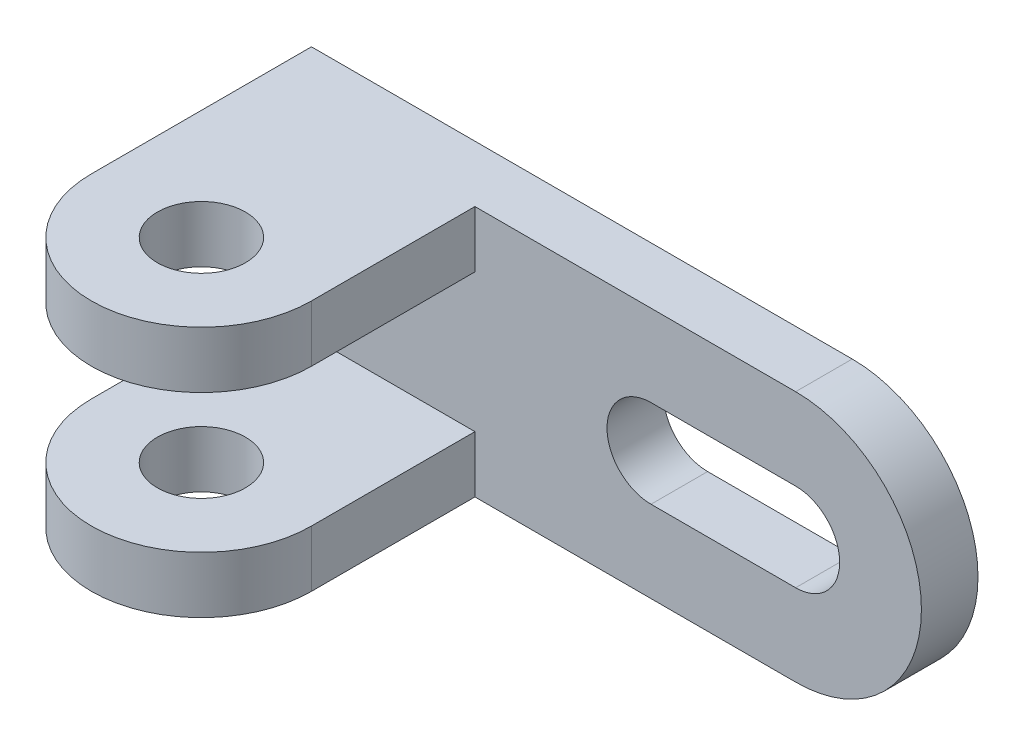
ISO-10303-21;
HEADER;
FILE_DESCRIPTION(('STEP AP214'),'2;1');
FILE_NAME('part.step','',(''),(''),'','','');
FILE_SCHEMA(('AUTOMOTIVE_DESIGN { 1 0 10303 214 1 1 1 1 }'));
ENDSEC;
DATA;
#1=APPLICATION_CONTEXT('core data for automotive mechanical design processes');
#2=APPLICATION_PROTOCOL_DEFINITION('international standard','automotive_design',2000,#1);
#3=PRODUCT_CONTEXT('',#1,'mechanical');
#4=PRODUCT('Part','Part','',(#3));
#5=PRODUCT_RELATED_PRODUCT_CATEGORY('part','',(#4));
#6=PRODUCT_DEFINITION_FORMATION('','',#4);
#7=PRODUCT_DEFINITION_CONTEXT('part definition',#1,'design');
#8=PRODUCT_DEFINITION('design','',#6,#7);
#9=PRODUCT_DEFINITION_SHAPE('','',#8);
#10=(LENGTH_UNIT() NAMED_UNIT(*) SI_UNIT(.MILLI.,.METRE.));
#11=(NAMED_UNIT(*) PLANE_ANGLE_UNIT() SI_UNIT($,.RADIAN.));
#12=(NAMED_UNIT(*) SI_UNIT($,.STERADIAN.) SOLID_ANGLE_UNIT());
#13=UNCERTAINTY_MEASURE_WITH_UNIT(LENGTH_MEASURE(1.E-05),#10,'distance_accuracy_value','');
#14=(GEOMETRIC_REPRESENTATION_CONTEXT(3) GLOBAL_UNCERTAINTY_ASSIGNED_CONTEXT((#13)) GLOBAL_UNIT_ASSIGNED_CONTEXT((#10,
#11,#12)) REPRESENTATION_CONTEXT('',''));
#15=CARTESIAN_POINT('',(0.,0.,0.));
#16=DIRECTION('',(0.,0.,1.));
#17=DIRECTION('',(1.,0.,0.));
#18=AXIS2_PLACEMENT_3D('',#15,#16,#17);
#19=CARTESIAN_POINT('',(0.,0.,9.));
#20=DIRECTION('',(0.,0.,1.));
#21=DIRECTION('',(1.,0.,0.));
#22=AXIS2_PLACEMENT_3D('',#19,#20,#21);
#23=PLANE('',#22);
#24=CARTESIAN_POINT('',(-23.,0.,9.));
#25=DIRECTION('',(0.,0.,1.));
#26=DIRECTION('',(1.,0.,0.));
#27=AXIS2_PLACEMENT_3D('',#24,#25,#26);
#28=CIRCLE('',#27,7.);
#29=CARTESIAN_POINT('',(-23.,7.,9.));
#30=VERTEX_POINT('',#29);
#31=CARTESIAN_POINT('',(-23.,-7.,9.));
#32=VERTEX_POINT('',#31);
#33=EDGE_CURVE('E241',#30,#32,#28,.T.);
#34=ORIENTED_EDGE('',*,*,#33,.F.);
#35=DIRECTION('',(1.,0.,0.));
#36=VECTOR('',#35,1.);
#37=CARTESIAN_POINT('',(0.,7.,9.));
#38=LINE('',#37,#36);
#39=CARTESIAN_POINT('',(0.,7.,9.));
#40=VERTEX_POINT('',#39);
#41=EDGE_CURVE('E245',#30,#40,#38,.T.);
#42=ORIENTED_EDGE('',*,*,#41,.T.);
#43=CARTESIAN_POINT('',(0.,0.,9.));
#44=DIRECTION('',(0.,0.,1.));
#45=DIRECTION('',(1.,0.,0.));
#46=AXIS2_PLACEMENT_3D('',#43,#44,#45);
#47=CIRCLE('',#46,7.);
#48=CARTESIAN_POINT('',(0.,-7.,9.));
#49=VERTEX_POINT('',#48);
#50=EDGE_CURVE('E249',#49,#40,#47,.T.);
#51=ORIENTED_EDGE('',*,*,#50,.F.);
#52=DIRECTION('',(1.,0.,0.));
#53=VECTOR('',#52,1.);
#54=CARTESIAN_POINT('',(0.,-7.,9.));
#55=LINE('',#54,#53);
#56=EDGE_CURVE('E253',#32,#49,#55,.T.);
#57=ORIENTED_EDGE('',*,*,#56,.F.);
#58=EDGE_LOOP('',(#34,#42,#51,#57));
#59=FACE_BOUND('',#58,.T.);
#60=DIRECTION('',(-1.,0.,0.));
#61=VECTOR('',#60,1.);
#62=CARTESIAN_POINT('',(0.,20.,9.));
#63=LINE('',#62,#61);
#64=CARTESIAN_POINT('',(0.,20.,9.));
#65=VERTEX_POINT('',#64);
#66=CARTESIAN_POINT('',(-51.,20.,9.));
#67=VERTEX_POINT('',#66);
#68=EDGE_CURVE('E263',#65,#67,#63,.T.);
#69=ORIENTED_EDGE('',*,*,#68,.T.);
#70=DIRECTION('',(0.,1.,0.));
#71=VECTOR('',#70,1.);
#72=CARTESIAN_POINT('',(-51.,11.,9.));
#73=LINE('',#72,#71);
#74=CARTESIAN_POINT('',(-51.,11.,9.));
#75=VERTEX_POINT('',#74);
#76=EDGE_CURVE('E63',#75,#67,#73,.T.);
#77=ORIENTED_EDGE('',*,*,#76,.F.);
#78=DIRECTION('',(1.,0.,0.));
#79=VECTOR('',#78,1.);
#80=CARTESIAN_POINT('',(0.,11.,9.));
#81=LINE('',#80,#79);
#82=CARTESIAN_POINT('',(-86.,11.,9.));
#83=VERTEX_POINT('',#82);
#84=EDGE_CURVE('E67',#83,#75,#81,.T.);
#85=ORIENTED_EDGE('',*,*,#84,.F.);
#86=DIRECTION('',(0.,-1.,0.));
#87=VECTOR('',#86,1.);
#88=CARTESIAN_POINT('',(-86.,0.,9.));
#89=LINE('',#88,#87);
#90=CARTESIAN_POINT('',(-86.,-11.,9.));
#91=VERTEX_POINT('',#90);
#92=EDGE_CURVE('E173',#83,#91,#89,.T.);
#93=ORIENTED_EDGE('',*,*,#92,.T.);
#94=DIRECTION('',(-1.,0.,0.));
#95=VECTOR('',#94,1.);
#96=CARTESIAN_POINT('',(0.,-11.,9.));
#97=LINE('',#96,#95);
#98=CARTESIAN_POINT('',(-51.,-11.,9.));
#99=VERTEX_POINT('',#98);
#100=EDGE_CURVE('E211',#99,#91,#97,.T.);
#101=ORIENTED_EDGE('',*,*,#100,.F.);
#102=DIRECTION('',(0.,-1.,0.));
#103=VECTOR('',#102,1.);
#104=CARTESIAN_POINT('',(-51.,-11.,9.));
#105=LINE('',#104,#103);
#106=CARTESIAN_POINT('',(-51.,-20.,9.));
#107=VERTEX_POINT('',#106);
#108=EDGE_CURVE('E234',#99,#107,#105,.T.);
#109=ORIENTED_EDGE('',*,*,#108,.T.);
#110=DIRECTION('',(1.,0.,0.));
#111=VECTOR('',#110,1.);
#112=CARTESIAN_POINT('',(0.,-20.,9.));
#113=LINE('',#112,#111);
#114=CARTESIAN_POINT('',(0.,-20.,9.));
#115=VERTEX_POINT('',#114);
#116=EDGE_CURVE('E257',#107,#115,#113,.T.);
#117=ORIENTED_EDGE('',*,*,#116,.T.);
#118=CARTESIAN_POINT('',(0.,0.,9.));
#119=DIRECTION('',(0.,0.,1.));
#120=DIRECTION('',(1.,0.,0.));
#121=AXIS2_PLACEMENT_3D('',#118,#119,#120);
#122=CIRCLE('',#121,20.);
#123=EDGE_CURVE('E260',#115,#65,#122,.T.);
#124=ORIENTED_EDGE('',*,*,#123,.T.);
#125=EDGE_LOOP('',(#69,#77,#85,#93,#101,#109,#117,#124));
#126=FACE_BOUND('',#125,.T.);
#127=ADVANCED_FACE('F45',(#59,#126),#23,.T.);
#128=CARTESIAN_POINT('',(0.,-20.,9.));
#129=DIRECTION('',(0.,1.,0.));
#130=DIRECTION('',(-1.,0.,0.));
#131=AXIS2_PLACEMENT_3D('',#128,#129,#130);
#132=PLANE('',#131);
#133=DIRECTION('',(1.,0.,0.));
#134=VECTOR('',#133,1.);
#135=CARTESIAN_POINT('',(0.,-20.,0.));
#136=LINE('',#135,#134);
#137=CARTESIAN_POINT('',(-86.,-20.,0.));
#138=VERTEX_POINT('',#137);
#139=CARTESIAN_POINT('',(0.,-20.,0.));
#140=VERTEX_POINT('',#139);
#141=EDGE_CURVE('E284',#138,#140,#136,.T.);
#142=ORIENTED_EDGE('',*,*,#141,.T.);
#143=DIRECTION('',(0.,0.,-1.));
#144=VECTOR('',#143,1.);
#145=CARTESIAN_POINT('',(0.,-20.,9.));
#146=LINE('',#145,#144);
#147=EDGE_CURVE('E11',#115,#140,#146,.T.);
#148=ORIENTED_EDGE('',*,*,#147,.F.);
#149=ORIENTED_EDGE('',*,*,#116,.F.);
#150=DIRECTION('',(0.,0.,1.));
#151=VECTOR('',#150,1.);
#152=CARTESIAN_POINT('',(-51.,-20.,0.));
#153=LINE('',#152,#151);
#154=CARTESIAN_POINT('',(-51.,-20.,35.));
#155=VERTEX_POINT('',#154);
#156=EDGE_CURVE('E204',#107,#155,#153,.T.);
#157=ORIENTED_EDGE('',*,*,#156,.T.);
#158=CARTESIAN_POINT('',(-68.5,-20.,35.));
#159=DIRECTION('',(0.,-1.,0.));
#160=DIRECTION('',(1.,0.,0.));
#161=AXIS2_PLACEMENT_3D('',#158,#159,#160);
#162=CIRCLE('',#161,17.5);
#163=CARTESIAN_POINT('',(-86.,-20.,35.));
#164=VERTEX_POINT('',#163);
#165=EDGE_CURVE('E223',#155,#164,#162,.T.);
#166=ORIENTED_EDGE('',*,*,#165,.T.);
#167=DIRECTION('',(0.,0.,-1.));
#168=VECTOR('',#167,1.);
#169=CARTESIAN_POINT('',(-86.,-20.,9.));
#170=LINE('',#169,#168);
#171=EDGE_CURVE('E296',#164,#138,#170,.T.);
#172=ORIENTED_EDGE('',*,*,#171,.T.);
#173=EDGE_LOOP('',(#142,#148,#149,#157,#166,#172));
#174=FACE_BOUND('',#173,.T.);
#175=CARTESIAN_POINT('',(-68.5,-20.,35.));
#176=DIRECTION('',(0.,-1.,0.));
#177=DIRECTION('',(1.,0.,0.));
#178=AXIS2_PLACEMENT_3D('',#175,#176,#177);
#179=CIRCLE('',#178,7.00000000000001);
#180=CARTESIAN_POINT('',(-61.5,-20.,35.));
#181=VERTEX_POINT('',#180);
#182=EDGE_CURVE('E196',#181,#181,#179,.T.);
#183=ORIENTED_EDGE('',*,*,#182,.F.);
#184=EDGE_LOOP('',(#183));
#185=FACE_BOUND('',#184,.T.);
#186=ADVANCED_FACE('F340',(#174,#185),#132,.F.);
#187=CARTESIAN_POINT('',(0.,0.,9.));
#188=DIRECTION('',(0.,0.,-1.));
#189=DIRECTION('',(-1.,0.,0.));
#190=AXIS2_PLACEMENT_3D('',#187,#188,#189);
#191=CYLINDRICAL_SURFACE('',#190,20.);
#192=CARTESIAN_POINT('',(0.,0.,0.));
#193=DIRECTION('',(0.,0.,1.));
#194=DIRECTION('',(1.,0.,0.));
#195=AXIS2_PLACEMENT_3D('',#192,#193,#194);
#196=CIRCLE('',#195,20.);
#197=CARTESIAN_POINT('',(0.,20.,0.));
#198=VERTEX_POINT('',#197);
#199=EDGE_CURVE('E288',#140,#198,#196,.T.);
#200=ORIENTED_EDGE('',*,*,#199,.T.);
#201=DIRECTION('',(0.,0.,-1.));
#202=VECTOR('',#201,1.);
#203=CARTESIAN_POINT('',(0.,20.,9.));
#204=LINE('',#203,#202);
#205=EDGE_CURVE('E55',#65,#198,#204,.T.);
#206=ORIENTED_EDGE('',*,*,#205,.F.);
#207=ORIENTED_EDGE('',*,*,#123,.F.);
#208=ORIENTED_EDGE('',*,*,#147,.T.);
#209=EDGE_LOOP('',(#200,#206,#207,#208));
#210=FACE_BOUND('',#209,.T.);
#211=ADVANCED_FACE('F346',(#210),#191,.T.);
#212=CARTESIAN_POINT('',(0.,20.,9.));
#213=DIRECTION('',(0.,-1.,0.));
#214=DIRECTION('',(1.,0.,0.));
#215=AXIS2_PLACEMENT_3D('',#212,#213,#214);
#216=PLANE('',#215);
#217=DIRECTION('',(-1.,0.,0.));
#218=VECTOR('',#217,1.);
#219=CARTESIAN_POINT('',(0.,20.,0.));
#220=LINE('',#219,#218);
#221=CARTESIAN_POINT('',(-86.,20.,0.));
#222=VERTEX_POINT('',#221);
#223=EDGE_CURVE('E291',#198,#222,#220,.T.);
#224=ORIENTED_EDGE('',*,*,#223,.T.);
#225=DIRECTION('',(0.,0.,-1.));
#226=VECTOR('',#225,1.);
#227=CARTESIAN_POINT('',(-86.,20.,9.));
#228=LINE('',#227,#226);
#229=CARTESIAN_POINT('',(-86.,20.,35.));
#230=VERTEX_POINT('',#229);
#231=EDGE_CURVE('E300',#230,#222,#228,.T.);
#232=ORIENTED_EDGE('',*,*,#231,.F.);
#233=CARTESIAN_POINT('',(-68.5,20.,35.));
#234=DIRECTION('',(0.,1.,0.));
#235=DIRECTION('',(-1.,0.,0.));
#236=AXIS2_PLACEMENT_3D('',#233,#234,#235);
#237=CIRCLE('',#236,17.5);
#238=CARTESIAN_POINT('',(-51.,20.,35.));
#239=VERTEX_POINT('',#238);
#240=EDGE_CURVE('E153',#230,#239,#237,.T.);
#241=ORIENTED_EDGE('',*,*,#240,.T.);
#242=DIRECTION('',(0.,0.,1.));
#243=VECTOR('',#242,1.);
#244=CARTESIAN_POINT('',(-51.,20.,0.));
#245=LINE('',#244,#243);
#246=EDGE_CURVE('E179',#67,#239,#245,.T.);
#247=ORIENTED_EDGE('',*,*,#246,.F.);
#248=ORIENTED_EDGE('',*,*,#68,.F.);
#249=ORIENTED_EDGE('',*,*,#205,.T.);
#250=EDGE_LOOP('',(#224,#232,#241,#247,#248,#249));
#251=FACE_BOUND('',#250,.T.);
#252=CARTESIAN_POINT('',(-68.5,20.,35.));
#253=DIRECTION('',(0.,1.,0.));
#254=DIRECTION('',(-1.,0.,0.));
#255=AXIS2_PLACEMENT_3D('',#252,#253,#254);
#256=CIRCLE('',#255,7.00000000000001);
#257=CARTESIAN_POINT('',(-75.5,20.,35.));
#258=VERTEX_POINT('',#257);
#259=EDGE_CURVE('E175',#258,#258,#256,.T.);
#260=ORIENTED_EDGE('',*,*,#259,.F.);
#261=EDGE_LOOP('',(#260));
#262=FACE_BOUND('',#261,.T.);
#263=ADVANCED_FACE('F358',(#251,#262),#216,.F.);
#264=CARTESIAN_POINT('',(-23.,0.,9.));
#265=DIRECTION('',(0.,0.,-1.));
#266=DIRECTION('',(-1.,0.,0.));
#267=AXIS2_PLACEMENT_3D('',#264,#265,#266);
#268=CYLINDRICAL_SURFACE('',#267,7.);
#269=CARTESIAN_POINT('',(-23.,0.,0.));
#270=DIRECTION('',(0.,0.,1.));
#271=DIRECTION('',(1.,0.,0.));
#272=AXIS2_PLACEMENT_3D('',#269,#270,#271);
#273=CIRCLE('',#272,7.);
#274=CARTESIAN_POINT('',(-23.,7.,0.));
#275=VERTEX_POINT('',#274);
#276=CARTESIAN_POINT('',(-23.,-7.,0.));
#277=VERTEX_POINT('',#276);
#278=EDGE_CURVE('E233',#275,#277,#273,.T.);
#279=ORIENTED_EDGE('',*,*,#278,.F.);
#280=DIRECTION('',(0.,0.,-1.));
#281=VECTOR('',#280,1.);
#282=CARTESIAN_POINT('',(-23.,7.,9.));
#283=LINE('',#282,#281);
#284=EDGE_CURVE('E49',#30,#275,#283,.T.);
#285=ORIENTED_EDGE('',*,*,#284,.F.);
#286=ORIENTED_EDGE('',*,*,#33,.T.);
#287=DIRECTION('',(0.,0.,-1.));
#288=VECTOR('',#287,1.);
#289=CARTESIAN_POINT('',(-23.,-7.,9.));
#290=LINE('',#289,#288);
#291=EDGE_CURVE('E268',#32,#277,#290,.T.);
#292=ORIENTED_EDGE('',*,*,#291,.T.);
#293=EDGE_LOOP('',(#279,#285,#286,#292));
#294=FACE_BOUND('',#293,.T.);
#295=ADVANCED_FACE('F47',(#294),#268,.F.);
#296=CARTESIAN_POINT('',(0.,7.,9.));
#297=DIRECTION('',(0.,1.,0.));
#298=DIRECTION('',(0.,0.,1.));
#299=AXIS2_PLACEMENT_3D('',#296,#297,#298);
#300=PLANE('',#299);
#301=DIRECTION('',(1.,0.,0.));
#302=VECTOR('',#301,1.);
#303=CARTESIAN_POINT('',(0.,7.,0.));
#304=LINE('',#303,#302);
#305=CARTESIAN_POINT('',(0.,7.,0.));
#306=VERTEX_POINT('',#305);
#307=EDGE_CURVE('E272',#275,#306,#304,.T.);
#308=ORIENTED_EDGE('',*,*,#307,.T.);
#309=DIRECTION('',(0.,0.,-1.));
#310=VECTOR('',#309,1.);
#311=CARTESIAN_POINT('',(0.,7.,9.));
#312=LINE('',#311,#310);
#313=EDGE_CURVE('E310',#40,#306,#312,.T.);
#314=ORIENTED_EDGE('',*,*,#313,.F.);
#315=ORIENTED_EDGE('',*,*,#41,.F.);
#316=ORIENTED_EDGE('',*,*,#284,.T.);
#317=EDGE_LOOP('',(#308,#314,#315,#316));
#318=FACE_BOUND('',#317,.T.);
#319=ADVANCED_FACE('F319',(#318),#300,.F.);
#320=CARTESIAN_POINT('',(0.,0.,9.));
#321=DIRECTION('',(0.,0.,-1.));
#322=DIRECTION('',(-1.,0.,0.));
#323=AXIS2_PLACEMENT_3D('',#320,#321,#322);
#324=CYLINDRICAL_SURFACE('',#323,7.);
#325=CARTESIAN_POINT('',(0.,0.,0.));
#326=DIRECTION('',(0.,0.,1.));
#327=DIRECTION('',(1.,0.,0.));
#328=AXIS2_PLACEMENT_3D('',#325,#326,#327);
#329=CIRCLE('',#328,7.);
#330=CARTESIAN_POINT('',(0.,-7.,0.));
#331=VERTEX_POINT('',#330);
#332=EDGE_CURVE('E276',#331,#306,#329,.T.);
#333=ORIENTED_EDGE('',*,*,#332,.F.);
#334=DIRECTION('',(0.,0.,-1.));
#335=VECTOR('',#334,1.);
#336=CARTESIAN_POINT('',(0.,-7.,9.));
#337=LINE('',#336,#335);
#338=EDGE_CURVE('E308',#49,#331,#337,.T.);
#339=ORIENTED_EDGE('',*,*,#338,.F.);
#340=ORIENTED_EDGE('',*,*,#50,.T.);
#341=ORIENTED_EDGE('',*,*,#313,.T.);
#342=EDGE_LOOP('',(#333,#339,#340,#341));
#343=FACE_BOUND('',#342,.T.);
#344=ADVANCED_FACE('F331',(#343),#324,.F.);
#345=CARTESIAN_POINT('',(0.,-7.,9.));
#346=DIRECTION('',(0.,1.,0.));
#347=DIRECTION('',(0.,0.,1.));
#348=AXIS2_PLACEMENT_3D('',#345,#346,#347);
#349=PLANE('',#348);
#350=DIRECTION('',(1.,0.,0.));
#351=VECTOR('',#350,1.);
#352=CARTESIAN_POINT('',(0.,-7.,0.));
#353=LINE('',#352,#351);
#354=EDGE_CURVE('E280',#277,#331,#353,.T.);
#355=ORIENTED_EDGE('',*,*,#354,.F.);
#356=ORIENTED_EDGE('',*,*,#291,.F.);
#357=ORIENTED_EDGE('',*,*,#56,.T.);
#358=ORIENTED_EDGE('',*,*,#338,.T.);
#359=EDGE_LOOP('',(#355,#356,#357,#358));
#360=FACE_BOUND('',#359,.T.);
#361=ADVANCED_FACE('F329',(#360),#349,.T.);
#362=CARTESIAN_POINT('',(-86.,0.,9.));
#363=DIRECTION('',(1.,0.,0.));
#364=DIRECTION('',(0.,0.,-1.));
#365=AXIS2_PLACEMENT_3D('',#362,#363,#364);
#366=PLANE('',#365);
#367=DIRECTION('',(0.,-1.,0.));
#368=VECTOR('',#367,1.);
#369=CARTESIAN_POINT('',(-86.,0.,0.));
#370=LINE('',#369,#368);
#371=EDGE_CURVE('E246',#222,#138,#370,.T.);
#372=ORIENTED_EDGE('',*,*,#371,.T.);
#373=ORIENTED_EDGE('',*,*,#171,.F.);
#374=DIRECTION('',(0.,-1.,0.));
#375=VECTOR('',#374,1.);
#376=CARTESIAN_POINT('',(-86.,-11.,35.));
#377=LINE('',#376,#375);
#378=CARTESIAN_POINT('',(-86.,-11.,35.));
#379=VERTEX_POINT('',#378);
#380=EDGE_CURVE('E219',#379,#164,#377,.T.);
#381=ORIENTED_EDGE('',*,*,#380,.F.);
#382=DIRECTION('',(0.,0.,1.));
#383=VECTOR('',#382,1.);
#384=CARTESIAN_POINT('',(-86.,-11.,0.));
#385=LINE('',#384,#383);
#386=EDGE_CURVE('E208',#91,#379,#385,.T.);
#387=ORIENTED_EDGE('',*,*,#386,.F.);
#388=ORIENTED_EDGE('',*,*,#92,.F.);
#389=DIRECTION('',(0.,0.,1.));
#390=VECTOR('',#389,1.);
#391=CARTESIAN_POINT('',(-86.,11.,0.));
#392=LINE('',#391,#390);
#393=CARTESIAN_POINT('',(-86.,11.,35.));
#394=VERTEX_POINT('',#393);
#395=EDGE_CURVE('E165',#83,#394,#392,.T.);
#396=ORIENTED_EDGE('',*,*,#395,.T.);
#397=DIRECTION('',(0.,1.,0.));
#398=VECTOR('',#397,1.);
#399=CARTESIAN_POINT('',(-86.,11.,35.));
#400=LINE('',#399,#398);
#401=EDGE_CURVE('E148',#394,#230,#400,.T.);
#402=ORIENTED_EDGE('',*,*,#401,.T.);
#403=ORIENTED_EDGE('',*,*,#231,.T.);
#404=EDGE_LOOP('',(#372,#373,#381,#387,#388,#396,#402,#403));
#405=FACE_BOUND('',#404,.T.);
#406=ADVANCED_FACE('F171',(#405),#366,.F.);
#407=CARTESIAN_POINT('',(0.,0.,0.));
#408=DIRECTION('',(0.,0.,1.));
#409=DIRECTION('',(1.,0.,0.));
#410=AXIS2_PLACEMENT_3D('',#407,#408,#409);
#411=PLANE('',#410);
#412=ORIENTED_EDGE('',*,*,#278,.T.);
#413=ORIENTED_EDGE('',*,*,#354,.T.);
#414=ORIENTED_EDGE('',*,*,#332,.T.);
#415=ORIENTED_EDGE('',*,*,#307,.F.);
#416=EDGE_LOOP('',(#412,#413,#414,#415));
#417=FACE_BOUND('',#416,.T.);
#418=ORIENTED_EDGE('',*,*,#141,.F.);
#419=ORIENTED_EDGE('',*,*,#371,.F.);
#420=ORIENTED_EDGE('',*,*,#223,.F.);
#421=ORIENTED_EDGE('',*,*,#199,.F.);
#422=EDGE_LOOP('',(#418,#419,#420,#421));
#423=FACE_BOUND('',#422,.T.);
#424=ADVANCED_FACE('F324',(#417,#423),#411,.F.);
#425=CARTESIAN_POINT('',(-68.5,-11.,35.));
#426=DIRECTION('',(0.,-1.,0.));
#427=DIRECTION('',(1.,0.,0.));
#428=AXIS2_PLACEMENT_3D('',#425,#426,#427);
#429=CYLINDRICAL_SURFACE('',#428,17.5);
#430=ORIENTED_EDGE('',*,*,#165,.F.);
#431=DIRECTION('',(0.,-1.,0.));
#432=VECTOR('',#431,1.);
#433=CARTESIAN_POINT('',(-51.,-11.,35.));
#434=LINE('',#433,#432);
#435=CARTESIAN_POINT('',(-51.,-11.,35.));
#436=VERTEX_POINT('',#435);
#437=EDGE_CURVE('E230',#436,#155,#434,.T.);
#438=ORIENTED_EDGE('',*,*,#437,.F.);
#439=CARTESIAN_POINT('',(-68.5,-11.,35.));
#440=DIRECTION('',(0.,-1.,0.));
#441=DIRECTION('',(1.,0.,0.));
#442=AXIS2_PLACEMENT_3D('',#439,#440,#441);
#443=CIRCLE('',#442,17.5);
#444=EDGE_CURVE('E203',#436,#379,#443,.T.);
#445=ORIENTED_EDGE('',*,*,#444,.T.);
#446=ORIENTED_EDGE('',*,*,#380,.T.);
#447=EDGE_LOOP('',(#430,#438,#445,#446));
#448=FACE_BOUND('',#447,.T.);
#449=ADVANCED_FACE('F355',(#448),#429,.T.);
#450=CARTESIAN_POINT('',(-51.,-11.,0.));
#451=DIRECTION('',(1.,0.,0.));
#452=DIRECTION('',(0.,1.,0.));
#453=AXIS2_PLACEMENT_3D('',#450,#451,#452);
#454=PLANE('',#453);
#455=ORIENTED_EDGE('',*,*,#156,.F.);
#456=ORIENTED_EDGE('',*,*,#108,.F.);
#457=DIRECTION('',(0.,0.,1.));
#458=VECTOR('',#457,1.);
#459=CARTESIAN_POINT('',(-51.,-11.,0.));
#460=LINE('',#459,#458);
#461=EDGE_CURVE('E215',#99,#436,#460,.T.);
#462=ORIENTED_EDGE('',*,*,#461,.T.);
#463=ORIENTED_EDGE('',*,*,#437,.T.);
#464=EDGE_LOOP('',(#455,#456,#462,#463));
#465=FACE_BOUND('',#464,.T.);
#466=ADVANCED_FACE('F386',(#465),#454,.T.);
#467=CARTESIAN_POINT('',(-68.5,-11.,35.));
#468=DIRECTION('',(0.,-1.,0.));
#469=DIRECTION('',(1.,0.,0.));
#470=AXIS2_PLACEMENT_3D('',#467,#468,#469);
#471=CYLINDRICAL_SURFACE('',#470,7.00000000000001);
#472=CARTESIAN_POINT('',(-68.5,-11.,35.));
#473=DIRECTION('',(0.,-1.,0.));
#474=DIRECTION('',(1.,0.,0.));
#475=AXIS2_PLACEMENT_3D('',#472,#473,#474);
#476=CIRCLE('',#475,7.00000000000001);
#477=CARTESIAN_POINT('',(-61.5,-11.,35.));
#478=VERTEX_POINT('',#477);
#479=EDGE_CURVE('E199',#478,#478,#476,.T.);
#480=ORIENTED_EDGE('',*,*,#479,.F.);
#481=EDGE_LOOP('',(#480));
#482=FACE_BOUND('',#481,.T.);
#483=ORIENTED_EDGE('',*,*,#182,.T.);
#484=EDGE_LOOP('',(#483));
#485=FACE_BOUND('',#484,.T.);
#486=ADVANCED_FACE('F351',(#482,#485),#471,.F.);
#487=CARTESIAN_POINT('',(0.,-11.,0.));
#488=DIRECTION('',(0.,-1.,0.));
#489=DIRECTION('',(1.,0.,0.));
#490=AXIS2_PLACEMENT_3D('',#487,#488,#489);
#491=PLANE('',#490);
#492=ORIENTED_EDGE('',*,*,#479,.T.);
#493=EDGE_LOOP('',(#492));
#494=FACE_BOUND('',#493,.T.);
#495=ORIENTED_EDGE('',*,*,#444,.F.);
#496=ORIENTED_EDGE('',*,*,#461,.F.);
#497=ORIENTED_EDGE('',*,*,#100,.T.);
#498=ORIENTED_EDGE('',*,*,#386,.T.);
#499=EDGE_LOOP('',(#495,#496,#497,#498));
#500=FACE_BOUND('',#499,.T.);
#501=ADVANCED_FACE('F384',(#494,#500),#491,.F.);
#502=CARTESIAN_POINT('',(-51.,11.,0.));
#503=DIRECTION('',(-1.,0.,0.));
#504=DIRECTION('',(0.,0.,1.));
#505=AXIS2_PLACEMENT_3D('',#502,#503,#504);
#506=PLANE('',#505);
#507=ORIENTED_EDGE('',*,*,#246,.T.);
#508=DIRECTION('',(0.,1.,0.));
#509=VECTOR('',#508,1.);
#510=CARTESIAN_POINT('',(-51.,11.,35.));
#511=LINE('',#510,#509);
#512=CARTESIAN_POINT('',(-51.,11.,35.));
#513=VERTEX_POINT('',#512);
#514=EDGE_CURVE('E158',#513,#239,#511,.T.);
#515=ORIENTED_EDGE('',*,*,#514,.F.);
#516=DIRECTION('',(0.,0.,1.));
#517=VECTOR('',#516,1.);
#518=CARTESIAN_POINT('',(-51.,11.,0.));
#519=LINE('',#518,#517);
#520=EDGE_CURVE('E167',#75,#513,#519,.T.);
#521=ORIENTED_EDGE('',*,*,#520,.F.);
#522=ORIENTED_EDGE('',*,*,#76,.T.);
#523=EDGE_LOOP('',(#507,#515,#521,#522));
#524=FACE_BOUND('',#523,.T.);
#525=ADVANCED_FACE('F397',(#524),#506,.F.);
#526=CARTESIAN_POINT('',(-68.5,11.,35.));
#527=DIRECTION('',(0.,1.,0.));
#528=DIRECTION('',(-1.,0.,0.));
#529=AXIS2_PLACEMENT_3D('',#526,#527,#528);
#530=CYLINDRICAL_SURFACE('',#529,17.5);
#531=ORIENTED_EDGE('',*,*,#240,.F.);
#532=ORIENTED_EDGE('',*,*,#401,.F.);
#533=CARTESIAN_POINT('',(-68.5,11.,35.));
#534=DIRECTION('',(0.,1.,0.));
#535=DIRECTION('',(-1.,0.,0.));
#536=AXIS2_PLACEMENT_3D('',#533,#534,#535);
#537=CIRCLE('',#536,17.5);
#538=EDGE_CURVE('E151',#394,#513,#537,.T.);
#539=ORIENTED_EDGE('',*,*,#538,.T.);
#540=ORIENTED_EDGE('',*,*,#514,.T.);
#541=EDGE_LOOP('',(#531,#532,#539,#540));
#542=FACE_BOUND('',#541,.T.);
#543=ADVANCED_FACE('F150',(#542),#530,.T.);
#544=CARTESIAN_POINT('',(-68.5,11.,35.));
#545=DIRECTION('',(0.,1.,0.));
#546=DIRECTION('',(-1.,0.,0.));
#547=AXIS2_PLACEMENT_3D('',#544,#545,#546);
#548=CYLINDRICAL_SURFACE('',#547,7.00000000000001);
#549=CARTESIAN_POINT('',(-68.5,11.,35.));
#550=DIRECTION('',(0.,1.,0.));
#551=DIRECTION('',(-1.,0.,0.));
#552=AXIS2_PLACEMENT_3D('',#549,#550,#551);
#553=CIRCLE('',#552,7.00000000000001);
#554=CARTESIAN_POINT('',(-75.5,11.,35.));
#555=VERTEX_POINT('',#554);
#556=EDGE_CURVE('E159',#555,#555,#553,.T.);
#557=ORIENTED_EDGE('',*,*,#556,.F.);
#558=EDGE_LOOP('',(#557));
#559=FACE_BOUND('',#558,.T.);
#560=ORIENTED_EDGE('',*,*,#259,.T.);
#561=EDGE_LOOP('',(#560));
#562=FACE_BOUND('',#561,.T.);
#563=ADVANCED_FACE('F401',(#559,#562),#548,.F.);
#564=CARTESIAN_POINT('',(0.,11.,0.));
#565=DIRECTION('',(0.,1.,0.));
#566=DIRECTION('',(-1.,0.,0.));
#567=AXIS2_PLACEMENT_3D('',#564,#565,#566);
#568=PLANE('',#567);
#569=ORIENTED_EDGE('',*,*,#395,.F.);
#570=ORIENTED_EDGE('',*,*,#84,.T.);
#571=ORIENTED_EDGE('',*,*,#520,.T.);
#572=ORIENTED_EDGE('',*,*,#538,.F.);
#573=EDGE_LOOP('',(#569,#570,#571,#572));
#574=FACE_BOUND('',#573,.T.);
#575=ORIENTED_EDGE('',*,*,#556,.T.);
#576=EDGE_LOOP('',(#575));
#577=FACE_BOUND('',#576,.T.);
#578=ADVANCED_FACE('F163',(#574,#577),#568,.F.);
#579=CLOSED_SHELL('',(#127,#186,#211,#263,#295,#319,#344,#361,#406,#424,#449,#466,#486,#501,
#525,#543,#563,#578));
#580=MANIFOLD_SOLID_BREP('B2',#579);
#581=ADVANCED_BREP_SHAPE_REPRESENTATION('',(#18,#580),#14);
#582=SHAPE_DEFINITION_REPRESENTATION(#9,#581);
ENDSEC;
END-ISO-10303-21;
